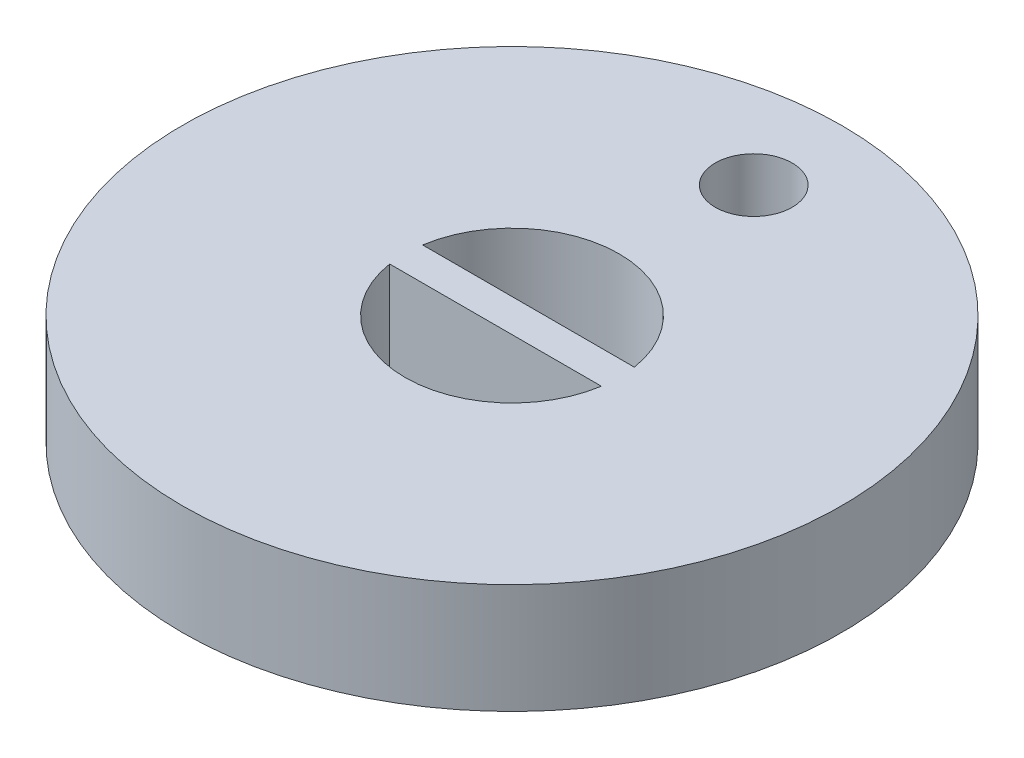
ISO-10303-21;
HEADER;
FILE_DESCRIPTION(('STEP AP214'),'2;1');
FILE_NAME('part.step','',(''),(''),'','','');
FILE_SCHEMA(('AUTOMOTIVE_DESIGN { 1 0 10303 214 1 1 1 1 }'));
ENDSEC;
DATA;
#1=APPLICATION_CONTEXT('core data for automotive mechanical design processes');
#2=APPLICATION_PROTOCOL_DEFINITION('international standard','automotive_design',2000,#1);
#3=PRODUCT_CONTEXT('',#1,'mechanical');
#4=PRODUCT('Part','Part','',(#3));
#5=PRODUCT_RELATED_PRODUCT_CATEGORY('part','',(#4));
#6=PRODUCT_DEFINITION_FORMATION('','',#4);
#7=PRODUCT_DEFINITION_CONTEXT('part definition',#1,'design');
#8=PRODUCT_DEFINITION('design','',#6,#7);
#9=PRODUCT_DEFINITION_SHAPE('','',#8);
#10=(LENGTH_UNIT() NAMED_UNIT(*) SI_UNIT(.MILLI.,.METRE.));
#11=(NAMED_UNIT(*) PLANE_ANGLE_UNIT() SI_UNIT($,.RADIAN.));
#12=(NAMED_UNIT(*) SI_UNIT($,.STERADIAN.) SOLID_ANGLE_UNIT());
#13=UNCERTAINTY_MEASURE_WITH_UNIT(LENGTH_MEASURE(1.E-05),#10,'distance_accuracy_value','');
#14=(GEOMETRIC_REPRESENTATION_CONTEXT(3) GLOBAL_UNCERTAINTY_ASSIGNED_CONTEXT((#13)) GLOBAL_UNIT_ASSIGNED_CONTEXT((#10,
#11,#12)) REPRESENTATION_CONTEXT('',''));
#15=CARTESIAN_POINT('',(0.,0.,0.));
#16=DIRECTION('',(0.,0.,1.));
#17=DIRECTION('',(1.,0.,0.));
#18=AXIS2_PLACEMENT_3D('',#15,#16,#17);
#19=CARTESIAN_POINT('',(0.,2.,0.));
#20=DIRECTION('',(0.,1.,0.));
#21=DIRECTION('',(0.,0.,1.));
#22=AXIS2_PLACEMENT_3D('',#19,#20,#21);
#23=PLANE('',#22);
#24=CARTESIAN_POINT('',(0.14362254200679,2.,-4.25738249520123));
#25=DIRECTION('',(0.,1.,0.));
#26=DIRECTION('',(0.,0.,1.));
#27=AXIS2_PLACEMENT_3D('',#24,#25,#26);
#28=CIRCLE('',#27,0.7);
#29=CARTESIAN_POINT('',(0.14362254200679,2.,-3.55738249520123));
#30=VERTEX_POINT('',#29);
#31=EDGE_CURVE('E110',#30,#30,#28,.T.);
#32=ORIENTED_EDGE('',*,*,#31,.F.);
#33=EDGE_LOOP('',(#32));
#34=FACE_BOUND('',#33,.T.);
#35=DIRECTION('',(1.,0.,0.));
#36=VECTOR('',#35,1.);
#37=CARTESIAN_POINT('',(0.,2.,-0.3));
#38=LINE('',#37,#36);
#39=CARTESIAN_POINT('',(-1.92678488679977,2.,-0.3));
#40=VERTEX_POINT('',#39);
#41=CARTESIAN_POINT('',(1.92678488679977,2.,-0.3));
#42=VERTEX_POINT('',#41);
#43=EDGE_CURVE('E61',#40,#42,#38,.T.);
#44=ORIENTED_EDGE('',*,*,#43,.F.);
#45=CARTESIAN_POINT('',(0.,2.,0.));
#46=DIRECTION('',(0.,1.,0.));
#47=DIRECTION('',(0.,0.,1.));
#48=AXIS2_PLACEMENT_3D('',#45,#46,#47);
#49=CIRCLE('',#48,1.95);
#50=EDGE_CURVE('E97',#42,#40,#49,.T.);
#51=ORIENTED_EDGE('',*,*,#50,.F.);
#52=EDGE_LOOP('',(#44,#51));
#53=FACE_BOUND('',#52,.T.);
#54=CARTESIAN_POINT('',(0.,2.,0.));
#55=DIRECTION('',(0.,1.,0.));
#56=DIRECTION('',(0.,0.,1.));
#57=AXIS2_PLACEMENT_3D('',#54,#55,#56);
#58=CIRCLE('',#57,6.);
#59=CARTESIAN_POINT('',(0.,2.,6.));
#60=VERTEX_POINT('',#59);
#61=EDGE_CURVE('E122',#60,#60,#58,.T.);
#62=ORIENTED_EDGE('',*,*,#61,.T.);
#63=EDGE_LOOP('',(#62));
#64=FACE_BOUND('',#63,.T.);
#65=CARTESIAN_POINT('',(0.,2.,0.));
#66=DIRECTION('',(0.,1.,0.));
#67=DIRECTION('',(0.,0.,1.));
#68=AXIS2_PLACEMENT_3D('',#65,#66,#67);
#69=CIRCLE('',#68,1.95);
#70=CARTESIAN_POINT('',(-1.92678488679977,2.,0.3));
#71=VERTEX_POINT('',#70);
#72=CARTESIAN_POINT('',(1.92678488679977,2.,0.3));
#73=VERTEX_POINT('',#72);
#74=EDGE_CURVE('E116',#71,#73,#69,.T.);
#75=ORIENTED_EDGE('',*,*,#74,.F.);
#76=DIRECTION('',(1.,0.,0.));
#77=VECTOR('',#76,1.);
#78=CARTESIAN_POINT('',(0.,2.,0.3));
#79=LINE('',#78,#77);
#80=EDGE_CURVE('E69',#71,#73,#79,.T.);
#81=ORIENTED_EDGE('',*,*,#80,.T.);
#82=EDGE_LOOP('',(#75,#81));
#83=FACE_BOUND('',#82,.T.);
#84=ADVANCED_FACE('F44',(#34,#53,#64,#83),#23,.T.);
#85=CARTESIAN_POINT('',(0.,0.,0.));
#86=DIRECTION('',(0.,1.,0.));
#87=DIRECTION('',(0.,0.,1.));
#88=AXIS2_PLACEMENT_3D('',#85,#86,#87);
#89=PLANE('',#88);
#90=CARTESIAN_POINT('',(0.14362254200679,0.,-4.25738249520123));
#91=DIRECTION('',(0.,1.,0.));
#92=DIRECTION('',(0.,0.,1.));
#93=AXIS2_PLACEMENT_3D('',#90,#91,#92);
#94=CIRCLE('',#93,0.7);
#95=CARTESIAN_POINT('',(0.14362254200679,0.,-3.55738249520123));
#96=VERTEX_POINT('',#95);
#97=EDGE_CURVE('E48',#96,#96,#94,.T.);
#98=ORIENTED_EDGE('',*,*,#97,.T.);
#99=EDGE_LOOP('',(#98));
#100=FACE_BOUND('',#99,.T.);
#101=CARTESIAN_POINT('',(0.,0.,0.));
#102=DIRECTION('',(0.,1.,0.));
#103=DIRECTION('',(0.,0.,1.));
#104=AXIS2_PLACEMENT_3D('',#101,#102,#103);
#105=CIRCLE('',#104,1.95);
#106=CARTESIAN_POINT('',(1.92678488679977,0.,-0.3));
#107=VERTEX_POINT('',#106);
#108=CARTESIAN_POINT('',(-1.92678488679977,0.,-0.3));
#109=VERTEX_POINT('',#108);
#110=EDGE_CURVE('E54',#107,#109,#105,.T.);
#111=ORIENTED_EDGE('',*,*,#110,.T.);
#112=DIRECTION('',(1.,0.,0.));
#113=VECTOR('',#112,1.);
#114=CARTESIAN_POINT('',(0.,0.,-0.3));
#115=LINE('',#114,#113);
#116=EDGE_CURVE('E11',#109,#107,#115,.T.);
#117=ORIENTED_EDGE('',*,*,#116,.T.);
#118=EDGE_LOOP('',(#111,#117));
#119=FACE_BOUND('',#118,.T.);
#120=CARTESIAN_POINT('',(0.,0.,0.));
#121=DIRECTION('',(0.,1.,0.));
#122=DIRECTION('',(0.,0.,1.));
#123=AXIS2_PLACEMENT_3D('',#120,#121,#122);
#124=CIRCLE('',#123,6.);
#125=CARTESIAN_POINT('',(0.,0.,6.));
#126=VERTEX_POINT('',#125);
#127=EDGE_CURVE('E93',#126,#126,#124,.T.);
#128=ORIENTED_EDGE('',*,*,#127,.F.);
#129=EDGE_LOOP('',(#128));
#130=FACE_BOUND('',#129,.T.);
#131=DIRECTION('',(1.,0.,0.));
#132=VECTOR('',#131,1.);
#133=CARTESIAN_POINT('',(0.,0.,0.3));
#134=LINE('',#133,#132);
#135=CARTESIAN_POINT('',(-1.92678488679977,0.,0.3));
#136=VERTEX_POINT('',#135);
#137=CARTESIAN_POINT('',(1.92678488679977,0.,0.3));
#138=VERTEX_POINT('',#137);
#139=EDGE_CURVE('E133',#136,#138,#134,.T.);
#140=ORIENTED_EDGE('',*,*,#139,.F.);
#141=CARTESIAN_POINT('',(0.,0.,0.));
#142=DIRECTION('',(0.,1.,0.));
#143=DIRECTION('',(0.,0.,1.));
#144=AXIS2_PLACEMENT_3D('',#141,#142,#143);
#145=CIRCLE('',#144,1.95);
#146=EDGE_CURVE('E126',#136,#138,#145,.T.);
#147=ORIENTED_EDGE('',*,*,#146,.T.);
#148=EDGE_LOOP('',(#140,#147));
#149=FACE_BOUND('',#148,.T.);
#150=ADVANCED_FACE('F139',(#100,#119,#130,#149),#89,.F.);
#151=CARTESIAN_POINT('',(0.,2.,0.));
#152=DIRECTION('',(0.,-1.,0.));
#153=DIRECTION('',(0.,0.,-1.));
#154=AXIS2_PLACEMENT_3D('',#151,#152,#153);
#155=CYLINDRICAL_SURFACE('',#154,6.);
#156=ORIENTED_EDGE('',*,*,#61,.F.);
#157=EDGE_LOOP('',(#156));
#158=FACE_BOUND('',#157,.T.);
#159=ORIENTED_EDGE('',*,*,#127,.T.);
#160=EDGE_LOOP('',(#159));
#161=FACE_BOUND('',#160,.T.);
#162=ADVANCED_FACE('F46',(#158,#161),#155,.T.);
#163=CARTESIAN_POINT('',(0.,-2.,0.3));
#164=DIRECTION('',(0.,0.,1.));
#165=DIRECTION('',(1.,0.,0.));
#166=AXIS2_PLACEMENT_3D('',#163,#164,#165);
#167=PLANE('',#166);
#168=ORIENTED_EDGE('',*,*,#139,.T.);
#169=DIRECTION('',(0.,1.,0.));
#170=VECTOR('',#169,1.);
#171=CARTESIAN_POINT('',(1.92678488679977,-2.,0.3));
#172=LINE('',#171,#170);
#173=EDGE_CURVE('E104',#138,#73,#172,.T.);
#174=ORIENTED_EDGE('',*,*,#173,.T.);
#175=ORIENTED_EDGE('',*,*,#80,.F.);
#176=DIRECTION('',(0.,1.,0.));
#177=VECTOR('',#176,1.);
#178=CARTESIAN_POINT('',(-1.92678488679977,-2.,0.3));
#179=LINE('',#178,#177);
#180=EDGE_CURVE('E107',#136,#71,#179,.T.);
#181=ORIENTED_EDGE('',*,*,#180,.F.);
#182=EDGE_LOOP('',(#168,#174,#175,#181));
#183=FACE_BOUND('',#182,.T.);
#184=ADVANCED_FACE('F146',(#183),#167,.T.);
#185=CARTESIAN_POINT('',(0.,-2.,0.));
#186=DIRECTION('',(0.,1.,0.));
#187=DIRECTION('',(0.,0.,1.));
#188=AXIS2_PLACEMENT_3D('',#185,#186,#187);
#189=CYLINDRICAL_SURFACE('',#188,1.95);
#190=ORIENTED_EDGE('',*,*,#180,.T.);
#191=ORIENTED_EDGE('',*,*,#74,.T.);
#192=ORIENTED_EDGE('',*,*,#173,.F.);
#193=ORIENTED_EDGE('',*,*,#146,.F.);
#194=EDGE_LOOP('',(#190,#191,#192,#193));
#195=FACE_BOUND('',#194,.T.);
#196=ADVANCED_FACE('F149',(#195),#189,.F.);
#197=CARTESIAN_POINT('',(0.,-2.,-0.3));
#198=DIRECTION('',(0.,0.,1.));
#199=DIRECTION('',(1.,0.,0.));
#200=AXIS2_PLACEMENT_3D('',#197,#198,#199);
#201=PLANE('',#200);
#202=DIRECTION('',(0.,1.,0.));
#203=VECTOR('',#202,1.);
#204=CARTESIAN_POINT('',(-1.92678488679977,-2.,-0.3));
#205=LINE('',#204,#203);
#206=EDGE_CURVE('E87',#109,#40,#205,.T.);
#207=ORIENTED_EDGE('',*,*,#206,.T.);
#208=ORIENTED_EDGE('',*,*,#43,.T.);
#209=DIRECTION('',(0.,1.,0.));
#210=VECTOR('',#209,1.);
#211=CARTESIAN_POINT('',(1.92678488679977,-2.,-0.3));
#212=LINE('',#211,#210);
#213=EDGE_CURVE('E94',#107,#42,#212,.T.);
#214=ORIENTED_EDGE('',*,*,#213,.F.);
#215=ORIENTED_EDGE('',*,*,#116,.F.);
#216=EDGE_LOOP('',(#207,#208,#214,#215));
#217=FACE_BOUND('',#216,.T.);
#218=ADVANCED_FACE('F89',(#217),#201,.F.);
#219=CARTESIAN_POINT('',(0.,-2.,0.));
#220=DIRECTION('',(0.,1.,0.));
#221=DIRECTION('',(0.,0.,1.));
#222=AXIS2_PLACEMENT_3D('',#219,#220,#221);
#223=CYLINDRICAL_SURFACE('',#222,1.95);
#224=ORIENTED_EDGE('',*,*,#213,.T.);
#225=ORIENTED_EDGE('',*,*,#50,.T.);
#226=ORIENTED_EDGE('',*,*,#206,.F.);
#227=ORIENTED_EDGE('',*,*,#110,.F.);
#228=EDGE_LOOP('',(#224,#225,#226,#227));
#229=FACE_BOUND('',#228,.T.);
#230=ADVANCED_FACE('F98',(#229),#223,.F.);
#231=CARTESIAN_POINT('',(0.14362254200679,-2.,-4.25738249520123));
#232=DIRECTION('',(0.,1.,0.));
#233=DIRECTION('',(0.,0.,1.));
#234=AXIS2_PLACEMENT_3D('',#231,#232,#233);
#235=CYLINDRICAL_SURFACE('',#234,0.7);
#236=ORIENTED_EDGE('',*,*,#31,.T.);
#237=EDGE_LOOP('',(#236));
#238=FACE_BOUND('',#237,.T.);
#239=ORIENTED_EDGE('',*,*,#97,.F.);
#240=EDGE_LOOP('',(#239));
#241=FACE_BOUND('',#240,.T.);
#242=ADVANCED_FACE('F166',(#238,#241),#235,.F.);
#243=CLOSED_SHELL('',(#84,#150,#162,#184,#196,#218,#230,#242));
#244=MANIFOLD_SOLID_BREP('B2',#243);
#245=ADVANCED_BREP_SHAPE_REPRESENTATION('',(#18,#244),#14);
#246=SHAPE_DEFINITION_REPRESENTATION(#9,#245);
ENDSEC;
END-ISO-10303-21;
